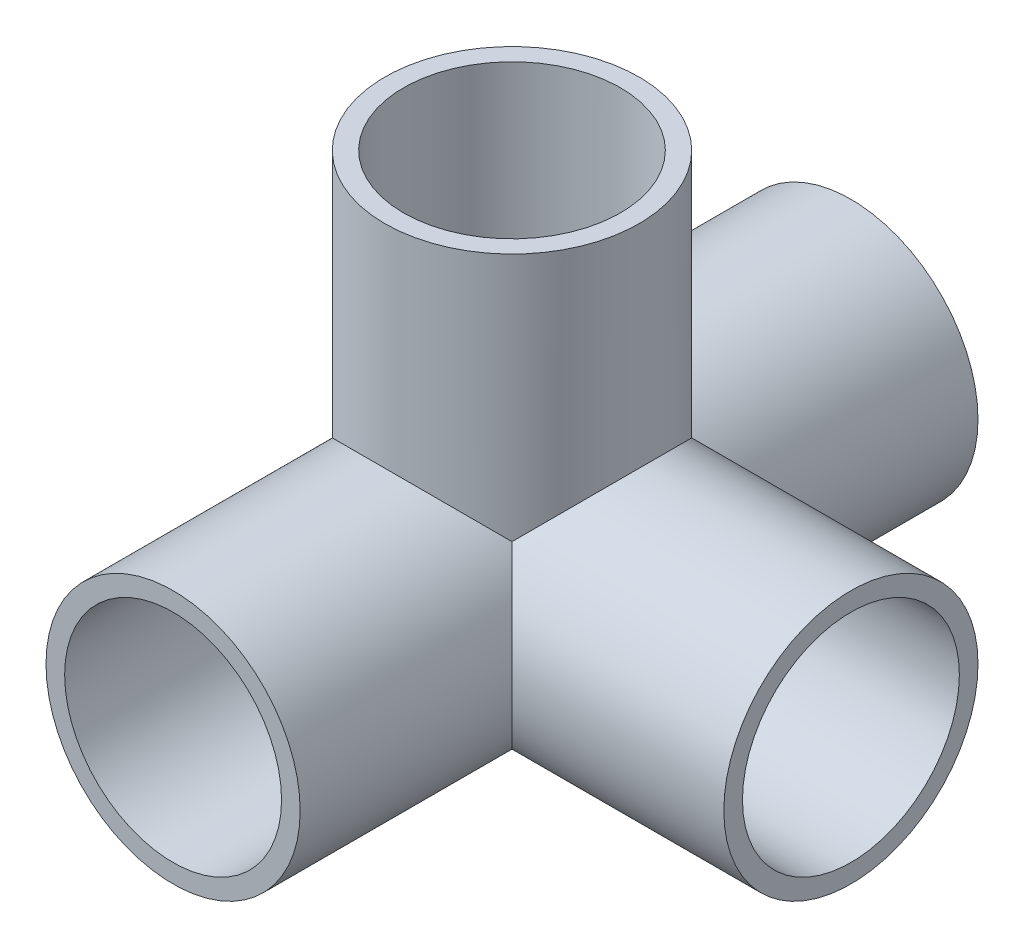
ISO-10303-21;
HEADER;
FILE_DESCRIPTION(('STEP AP214'),'2;1');
FILE_NAME('part.step','',(''),(''),'','','');
FILE_SCHEMA(('AUTOMOTIVE_DESIGN { 1 0 10303 214 1 1 1 1 }'));
ENDSEC;
DATA;
#1=APPLICATION_CONTEXT('core data for automotive mechanical design processes');
#2=APPLICATION_PROTOCOL_DEFINITION('international standard','automotive_design',2000,#1);
#3=PRODUCT_CONTEXT('',#1,'mechanical');
#4=PRODUCT('Part','Part','',(#3));
#5=PRODUCT_RELATED_PRODUCT_CATEGORY('part','',(#4));
#6=PRODUCT_DEFINITION_FORMATION('','',#4);
#7=PRODUCT_DEFINITION_CONTEXT('part definition',#1,'design');
#8=PRODUCT_DEFINITION('design','',#6,#7);
#9=PRODUCT_DEFINITION_SHAPE('','',#8);
#10=(LENGTH_UNIT() NAMED_UNIT(*) SI_UNIT(.MILLI.,.METRE.));
#11=(NAMED_UNIT(*) PLANE_ANGLE_UNIT() SI_UNIT($,.RADIAN.));
#12=(NAMED_UNIT(*) SI_UNIT($,.STERADIAN.) SOLID_ANGLE_UNIT());
#13=UNCERTAINTY_MEASURE_WITH_UNIT(LENGTH_MEASURE(1.E-05),#10,'distance_accuracy_value','');
#14=(GEOMETRIC_REPRESENTATION_CONTEXT(3) GLOBAL_UNCERTAINTY_ASSIGNED_CONTEXT((#13)) GLOBAL_UNIT_ASSIGNED_CONTEXT((#10,
#11,#12)) REPRESENTATION_CONTEXT('',''));
#15=CARTESIAN_POINT('',(0.,0.,0.));
#16=DIRECTION('',(0.,0.,1.));
#17=DIRECTION('',(1.,0.,0.));
#18=AXIS2_PLACEMENT_3D('',#15,#16,#17);
#19=CARTESIAN_POINT('',(0.,0.,-40.));
#20=DIRECTION('',(0.,0.,1.));
#21=DIRECTION('',(1.,0.,0.));
#22=AXIS2_PLACEMENT_3D('',#19,#20,#21);
#23=CYLINDRICAL_SURFACE('',#22,15.);
#24=CARTESIAN_POINT('',(0.,0.,-40.));
#25=DIRECTION('',(0.,0.,1.));
#26=DIRECTION('',(1.,0.,0.));
#27=AXIS2_PLACEMENT_3D('',#24,#25,#26);
#28=CIRCLE('',#27,15.);
#29=CARTESIAN_POINT('',(15.,0.,-40.));
#30=VERTEX_POINT('',#29);
#31=EDGE_CURVE('E137',#30,#30,#28,.T.);
#32=ORIENTED_EDGE('',*,*,#31,.T.);
#33=EDGE_LOOP('',(#32));
#34=FACE_BOUND('',#33,.T.);
#35=CARTESIAN_POINT('',(0.,0.,40.));
#36=DIRECTION('',(0.,0.,1.));
#37=DIRECTION('',(1.,0.,0.));
#38=AXIS2_PLACEMENT_3D('',#35,#36,#37);
#39=CIRCLE('',#38,15.);
#40=CARTESIAN_POINT('',(15.,0.,40.));
#41=VERTEX_POINT('',#40);
#42=EDGE_CURVE('E133',#41,#41,#39,.T.);
#43=ORIENTED_EDGE('',*,*,#42,.F.);
#44=EDGE_LOOP('',(#43));
#45=FACE_BOUND('',#44,.T.);
#46=CARTESIAN_POINT('',(0.,0.,0.));
#47=DIRECTION('',(0.707106781186547,0.,0.707106781186547));
#48=DIRECTION('',(-0.707106781186547,0.,0.707106781186547));
#49=AXIS2_PLACEMENT_3D('',#46,#47,#48);
#50=ELLIPSE('',#49,21.2132034355964,15.);
#51=CARTESIAN_POINT('',(10.6066017177982,10.6066017177982,-10.6066017177982));
#52=VERTEX_POINT('',#51);
#53=CARTESIAN_POINT('',(0.,-15.,0.));
#54=VERTEX_POINT('',#53);
#55=EDGE_CURVE('E54',#52,#54,#50,.F.);
#56=ORIENTED_EDGE('',*,*,#55,.T.);
#57=CARTESIAN_POINT('',(0.,0.,0.));
#58=DIRECTION('',(-0.707106781186547,0.,0.707106781186547));
#59=DIRECTION('',(0.707106781186547,0.,0.707106781186547));
#60=AXIS2_PLACEMENT_3D('',#57,#58,#59);
#61=ELLIPSE('',#60,21.2132034355964,15.);
#62=CARTESIAN_POINT('',(10.6066017177982,10.6066017177982,10.6066017177982));
#63=VERTEX_POINT('',#62);
#64=EDGE_CURVE('E126',#54,#63,#61,.T.);
#65=ORIENTED_EDGE('',*,*,#64,.T.);
#66=CARTESIAN_POINT('',(0.,0.,0.));
#67=DIRECTION('',(0.,-0.707106781186547,0.707106781186547));
#68=DIRECTION('',(0.,0.707106781186547,0.707106781186547));
#69=AXIS2_PLACEMENT_3D('',#66,#67,#68);
#70=ELLIPSE('',#69,21.2132034355964,15.);
#71=CARTESIAN_POINT('',(-15.,0.,0.));
#72=VERTEX_POINT('',#71);
#73=EDGE_CURVE('E47',#63,#72,#70,.T.);
#74=ORIENTED_EDGE('',*,*,#73,.T.);
#75=CARTESIAN_POINT('',(0.,0.,0.));
#76=DIRECTION('',(0.,0.707106781186547,0.707106781186547));
#77=DIRECTION('',(0.,-0.707106781186547,0.707106781186547));
#78=AXIS2_PLACEMENT_3D('',#75,#76,#77);
#79=ELLIPSE('',#78,21.2132034355964,15.);
#80=EDGE_CURVE('E141',#72,#52,#79,.F.);
#81=ORIENTED_EDGE('',*,*,#80,.T.);
#82=EDGE_LOOP('',(#56,#65,#74,#81));
#83=FACE_BOUND('',#82,.T.);
#84=ADVANCED_FACE('F39',(#34,#45,#83),#23,.T.);
#85=CARTESIAN_POINT('',(0.,40.,0.));
#86=DIRECTION('',(0.,-1.,0.));
#87=DIRECTION('',(0.,0.,-1.));
#88=AXIS2_PLACEMENT_3D('',#85,#86,#87);
#89=CYLINDRICAL_SURFACE('',#88,15.);
#90=CARTESIAN_POINT('',(0.,40.,0.));
#91=DIRECTION('',(0.,1.,0.));
#92=DIRECTION('',(0.,0.,1.));
#93=AXIS2_PLACEMENT_3D('',#90,#91,#92);
#94=CIRCLE('',#93,15.);
#95=CARTESIAN_POINT('',(0.,40.,15.));
#96=VERTEX_POINT('',#95);
#97=EDGE_CURVE('E129',#96,#96,#94,.T.);
#98=ORIENTED_EDGE('',*,*,#97,.F.);
#99=EDGE_LOOP('',(#98));
#100=FACE_BOUND('',#99,.T.);
#101=CARTESIAN_POINT('',(0.,0.,0.));
#102=DIRECTION('',(0.707106781186547,-0.707106781186547,0.));
#103=DIRECTION('',(-0.707106781186547,-0.707106781186547,0.));
#104=AXIS2_PLACEMENT_3D('',#101,#102,#103);
#105=ELLIPSE('',#104,21.2132034355964,15.);
#106=EDGE_CURVE('E11',#52,#63,#105,.T.);
#107=ORIENTED_EDGE('',*,*,#106,.F.);
#108=ORIENTED_EDGE('',*,*,#80,.F.);
#109=ORIENTED_EDGE('',*,*,#73,.F.);
#110=EDGE_LOOP('',(#107,#108,#109));
#111=FACE_BOUND('',#110,.T.);
#112=ADVANCED_FACE('F144',(#100,#111),#89,.T.);
#113=CARTESIAN_POINT('',(0.,0.,-40.));
#114=DIRECTION('',(0.,0.,1.));
#115=DIRECTION('',(1.,0.,0.));
#116=AXIS2_PLACEMENT_3D('',#113,#114,#115);
#117=PLANE('',#116);
#118=CARTESIAN_POINT('',(0.,0.,-40.));
#119=DIRECTION('',(0.,0.,1.));
#120=DIRECTION('',(1.,0.,0.));
#121=AXIS2_PLACEMENT_3D('',#118,#119,#120);
#122=CIRCLE('',#121,12.8);
#123=CARTESIAN_POINT('',(12.8,0.,-40.));
#124=VERTEX_POINT('',#123);
#125=EDGE_CURVE('E108',#124,#124,#122,.T.);
#126=ORIENTED_EDGE('',*,*,#125,.T.);
#127=EDGE_LOOP('',(#126));
#128=FACE_BOUND('',#127,.T.);
#129=ORIENTED_EDGE('',*,*,#31,.F.);
#130=EDGE_LOOP('',(#129));
#131=FACE_BOUND('',#130,.T.);
#132=ADVANCED_FACE('F146',(#128,#131),#117,.F.);
#133=CARTESIAN_POINT('',(0.,0.,40.));
#134=DIRECTION('',(0.,0.,1.));
#135=DIRECTION('',(1.,0.,0.));
#136=AXIS2_PLACEMENT_3D('',#133,#134,#135);
#137=PLANE('',#136);
#138=CARTESIAN_POINT('',(0.,0.,40.));
#139=DIRECTION('',(0.,0.,1.));
#140=DIRECTION('',(1.,0.,0.));
#141=AXIS2_PLACEMENT_3D('',#138,#139,#140);
#142=CIRCLE('',#141,12.8);
#143=CARTESIAN_POINT('',(12.8,0.,40.));
#144=VERTEX_POINT('',#143);
#145=EDGE_CURVE('E100',#144,#144,#142,.T.);
#146=ORIENTED_EDGE('',*,*,#145,.F.);
#147=EDGE_LOOP('',(#146));
#148=FACE_BOUND('',#147,.T.);
#149=ORIENTED_EDGE('',*,*,#42,.T.);
#150=EDGE_LOOP('',(#149));
#151=FACE_BOUND('',#150,.T.);
#152=ADVANCED_FACE('F153',(#148,#151),#137,.T.);
#153=CARTESIAN_POINT('',(0.,40.,0.));
#154=DIRECTION('',(0.,1.,0.));
#155=DIRECTION('',(0.,0.,1.));
#156=AXIS2_PLACEMENT_3D('',#153,#154,#155);
#157=PLANE('',#156);
#158=CARTESIAN_POINT('',(0.,40.,0.));
#159=DIRECTION('',(0.,1.,0.));
#160=DIRECTION('',(0.,0.,1.));
#161=AXIS2_PLACEMENT_3D('',#158,#159,#160);
#162=CIRCLE('',#161,12.8);
#163=CARTESIAN_POINT('',(0.,40.,12.8));
#164=VERTEX_POINT('',#163);
#165=EDGE_CURVE('E96',#164,#164,#162,.T.);
#166=ORIENTED_EDGE('',*,*,#165,.F.);
#167=EDGE_LOOP('',(#166));
#168=FACE_BOUND('',#167,.T.);
#169=ORIENTED_EDGE('',*,*,#97,.T.);
#170=EDGE_LOOP('',(#169));
#171=FACE_BOUND('',#170,.T.);
#172=ADVANCED_FACE('F159',(#168,#171),#157,.T.);
#173=CARTESIAN_POINT('',(40.,0.,0.));
#174=DIRECTION('',(-1.,0.,0.));
#175=DIRECTION('',(0.,0.,1.));
#176=AXIS2_PLACEMENT_3D('',#173,#174,#175);
#177=CYLINDRICAL_SURFACE('',#176,15.);
#178=ORIENTED_EDGE('',*,*,#64,.F.);
#179=ORIENTED_EDGE('',*,*,#55,.F.);
#180=ORIENTED_EDGE('',*,*,#106,.T.);
#181=EDGE_LOOP('',(#178,#179,#180));
#182=FACE_BOUND('',#181,.T.);
#183=CARTESIAN_POINT('',(40.,0.,0.));
#184=DIRECTION('',(1.,0.,0.));
#185=DIRECTION('',(0.,0.,-1.));
#186=AXIS2_PLACEMENT_3D('',#183,#184,#185);
#187=CIRCLE('',#186,15.);
#188=CARTESIAN_POINT('',(40.,0.,-15.));
#189=VERTEX_POINT('',#188);
#190=EDGE_CURVE('E111',#189,#189,#187,.T.);
#191=ORIENTED_EDGE('',*,*,#190,.F.);
#192=EDGE_LOOP('',(#191));
#193=FACE_BOUND('',#192,.T.);
#194=ADVANCED_FACE('F166',(#182,#193),#177,.T.);
#195=CARTESIAN_POINT('',(40.,0.,0.));
#196=DIRECTION('',(1.,0.,0.));
#197=DIRECTION('',(0.,0.,-1.));
#198=AXIS2_PLACEMENT_3D('',#195,#196,#197);
#199=PLANE('',#198);
#200=CARTESIAN_POINT('',(40.,0.,0.));
#201=DIRECTION('',(1.,0.,0.));
#202=DIRECTION('',(0.,0.,-1.));
#203=AXIS2_PLACEMENT_3D('',#200,#201,#202);
#204=CIRCLE('',#203,12.8);
#205=CARTESIAN_POINT('',(40.,0.,-12.8));
#206=VERTEX_POINT('',#205);
#207=EDGE_CURVE('E91',#206,#206,#204,.T.);
#208=ORIENTED_EDGE('',*,*,#207,.F.);
#209=EDGE_LOOP('',(#208));
#210=FACE_BOUND('',#209,.T.);
#211=ORIENTED_EDGE('',*,*,#190,.T.);
#212=EDGE_LOOP('',(#211));
#213=FACE_BOUND('',#212,.T.);
#214=ADVANCED_FACE('F175',(#210,#213),#199,.T.);
#215=CARTESIAN_POINT('',(0.,0.,-40.));
#216=DIRECTION('',(0.,0.,1.));
#217=DIRECTION('',(1.,0.,0.));
#218=AXIS2_PLACEMENT_3D('',#215,#216,#217);
#219=CYLINDRICAL_SURFACE('',#218,12.8);
#220=ORIENTED_EDGE('',*,*,#125,.F.);
#221=EDGE_LOOP('',(#220));
#222=FACE_BOUND('',#221,.T.);
#223=ORIENTED_EDGE('',*,*,#145,.T.);
#224=EDGE_LOOP('',(#223));
#225=FACE_BOUND('',#224,.T.);
#226=CARTESIAN_POINT('',(0.,0.,0.));
#227=DIRECTION('',(0.707106781186547,0.,0.707106781186547));
#228=DIRECTION('',(-0.707106781186547,0.,0.707106781186547));
#229=AXIS2_PLACEMENT_3D('',#226,#227,#228);
#230=ELLIPSE('',#229,18.1019335983756,12.8);
#231=CARTESIAN_POINT('',(9.05096679918781,9.05096679918781,-9.05096679918781));
#232=VERTEX_POINT('',#231);
#233=CARTESIAN_POINT('',(0.,-12.8,0.));
#234=VERTEX_POINT('',#233);
#235=EDGE_CURVE('E80',#232,#234,#230,.F.);
#236=ORIENTED_EDGE('',*,*,#235,.F.);
#237=CARTESIAN_POINT('',(0.,0.,0.));
#238=DIRECTION('',(0.,0.707106781186547,0.707106781186547));
#239=DIRECTION('',(0.,-0.707106781186547,0.707106781186547));
#240=AXIS2_PLACEMENT_3D('',#237,#238,#239);
#241=ELLIPSE('',#240,18.1019335983756,12.8);
#242=CARTESIAN_POINT('',(-12.8,0.,0.));
#243=VERTEX_POINT('',#242);
#244=EDGE_CURVE('E105',#243,#232,#241,.F.);
#245=ORIENTED_EDGE('',*,*,#244,.F.);
#246=CARTESIAN_POINT('',(0.,0.,0.));
#247=DIRECTION('',(0.,-0.707106781186547,0.707106781186547));
#248=DIRECTION('',(0.,0.707106781186547,0.707106781186547));
#249=AXIS2_PLACEMENT_3D('',#246,#247,#248);
#250=ELLIPSE('',#249,18.1019335983756,12.8);
#251=CARTESIAN_POINT('',(9.05096679918781,9.05096679918781,9.05096679918781));
#252=VERTEX_POINT('',#251);
#253=EDGE_CURVE('E94',#252,#243,#250,.T.);
#254=ORIENTED_EDGE('',*,*,#253,.F.);
#255=CARTESIAN_POINT('',(0.,0.,0.));
#256=DIRECTION('',(-0.707106781186547,0.,0.707106781186547));
#257=DIRECTION('',(0.707106781186547,0.,0.707106781186547));
#258=AXIS2_PLACEMENT_3D('',#255,#256,#257);
#259=ELLIPSE('',#258,18.1019335983756,12.8);
#260=EDGE_CURVE('E84',#234,#252,#259,.T.);
#261=ORIENTED_EDGE('',*,*,#260,.F.);
#262=EDGE_LOOP('',(#236,#245,#254,#261));
#263=FACE_BOUND('',#262,.T.);
#264=ADVANCED_FACE('F93',(#222,#225,#263),#219,.F.);
#265=CARTESIAN_POINT('',(0.,40.,0.));
#266=DIRECTION('',(0.,-1.,0.));
#267=DIRECTION('',(0.,0.,-1.));
#268=AXIS2_PLACEMENT_3D('',#265,#266,#267);
#269=CYLINDRICAL_SURFACE('',#268,12.8);
#270=ORIENTED_EDGE('',*,*,#165,.T.);
#271=EDGE_LOOP('',(#270));
#272=FACE_BOUND('',#271,.T.);
#273=CARTESIAN_POINT('',(0.,0.,0.));
#274=DIRECTION('',(0.707106781186547,-0.707106781186547,0.));
#275=DIRECTION('',(-0.707106781186547,-0.707106781186547,0.));
#276=AXIS2_PLACEMENT_3D('',#273,#274,#275);
#277=ELLIPSE('',#276,18.1019335983756,12.8);
#278=EDGE_CURVE('E86',#232,#252,#277,.T.);
#279=ORIENTED_EDGE('',*,*,#278,.T.);
#280=ORIENTED_EDGE('',*,*,#253,.T.);
#281=ORIENTED_EDGE('',*,*,#244,.T.);
#282=EDGE_LOOP('',(#279,#280,#281));
#283=FACE_BOUND('',#282,.T.);
#284=ADVANCED_FACE('F174',(#272,#283),#269,.F.);
#285=CARTESIAN_POINT('',(40.,0.,0.));
#286=DIRECTION('',(-1.,0.,0.));
#287=DIRECTION('',(0.,0.,1.));
#288=AXIS2_PLACEMENT_3D('',#285,#286,#287);
#289=CYLINDRICAL_SURFACE('',#288,12.8);
#290=ORIENTED_EDGE('',*,*,#260,.T.);
#291=ORIENTED_EDGE('',*,*,#278,.F.);
#292=ORIENTED_EDGE('',*,*,#235,.T.);
#293=EDGE_LOOP('',(#290,#291,#292));
#294=FACE_BOUND('',#293,.T.);
#295=ORIENTED_EDGE('',*,*,#207,.T.);
#296=EDGE_LOOP('',(#295));
#297=FACE_BOUND('',#296,.T.);
#298=ADVANCED_FACE('F82',(#294,#297),#289,.F.);
#299=CLOSED_SHELL('',(#84,#112,#132,#152,#172,#194,#214,#264,#284,#298));
#300=MANIFOLD_SOLID_BREP('B2',#299);
#301=ADVANCED_BREP_SHAPE_REPRESENTATION('',(#18,#300),#14);
#302=SHAPE_DEFINITION_REPRESENTATION(#9,#301);
ENDSEC;
END-ISO-10303-21;
